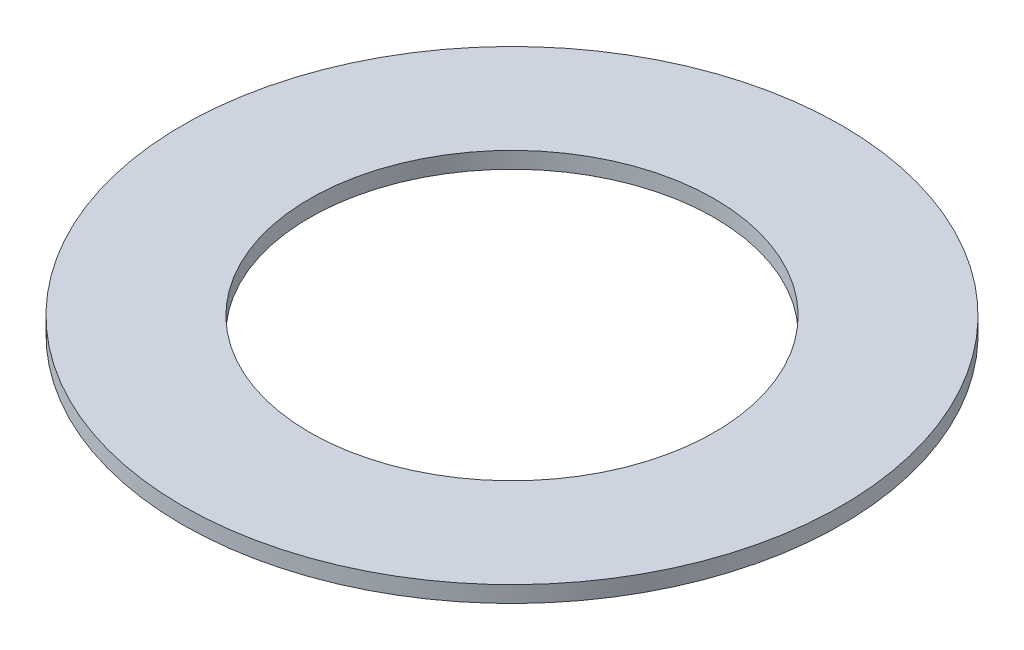
ISO-10303-21;
HEADER;
FILE_DESCRIPTION(('STEP AP214'),'2;1');
FILE_NAME('part.step','',(''),(''),'','','');
FILE_SCHEMA(('AUTOMOTIVE_DESIGN { 1 0 10303 214 1 1 1 1 }'));
ENDSEC;
DATA;
#1=APPLICATION_CONTEXT('core data for automotive mechanical design processes');
#2=APPLICATION_PROTOCOL_DEFINITION('international standard','automotive_design',2000,#1);
#3=PRODUCT_CONTEXT('',#1,'mechanical');
#4=PRODUCT('Part','Part','',(#3));
#5=PRODUCT_RELATED_PRODUCT_CATEGORY('part','',(#4));
#6=PRODUCT_DEFINITION_FORMATION('','',#4);
#7=PRODUCT_DEFINITION_CONTEXT('part definition',#1,'design');
#8=PRODUCT_DEFINITION('design','',#6,#7);
#9=PRODUCT_DEFINITION_SHAPE('','',#8);
#10=(LENGTH_UNIT() NAMED_UNIT(*) SI_UNIT(.MILLI.,.METRE.));
#11=(NAMED_UNIT(*) PLANE_ANGLE_UNIT() SI_UNIT($,.RADIAN.));
#12=(NAMED_UNIT(*) SI_UNIT($,.STERADIAN.) SOLID_ANGLE_UNIT());
#13=UNCERTAINTY_MEASURE_WITH_UNIT(LENGTH_MEASURE(1.E-05),#10,'distance_accuracy_value','');
#14=(GEOMETRIC_REPRESENTATION_CONTEXT(3) GLOBAL_UNCERTAINTY_ASSIGNED_CONTEXT((#13)) GLOBAL_UNIT_ASSIGNED_CONTEXT((#10,
#11,#12)) REPRESENTATION_CONTEXT('',''));
#15=CARTESIAN_POINT('',(0.,0.,0.));
#16=DIRECTION('',(0.,0.,1.));
#17=DIRECTION('',(1.,0.,0.));
#18=AXIS2_PLACEMENT_3D('',#15,#16,#17);
#19=CARTESIAN_POINT('',(0.,4.,0.));
#20=DIRECTION('',(0.,1.,0.));
#21=DIRECTION('',(0.,0.,1.));
#22=AXIS2_PLACEMENT_3D('',#19,#20,#21);
#23=PLANE('',#22);
#24=CARTESIAN_POINT('',(0.,4.,0.));
#25=DIRECTION('',(0.,1.,0.));
#26=DIRECTION('',(0.,0.,1.));
#27=AXIS2_PLACEMENT_3D('',#24,#25,#26);
#28=CIRCLE('',#27,80.7);
#29=CARTESIAN_POINT('',(0.,4.,80.7));
#30=VERTEX_POINT('',#29);
#31=EDGE_CURVE('E10',#30,#30,#28,.T.);
#32=ORIENTED_EDGE('',*,*,#31,.T.);
#33=EDGE_LOOP('',(#32));
#34=FACE_BOUND('',#33,.T.);
#35=CARTESIAN_POINT('',(0.,4.,0.));
#36=DIRECTION('',(0.,1.,0.));
#37=DIRECTION('',(0.,0.,1.));
#38=AXIS2_PLACEMENT_3D('',#35,#36,#37);
#39=CIRCLE('',#38,49.55);
#40=CARTESIAN_POINT('',(0.,4.,49.55));
#41=VERTEX_POINT('',#40);
#42=EDGE_CURVE('E52',#41,#41,#39,.T.);
#43=ORIENTED_EDGE('',*,*,#42,.F.);
#44=EDGE_LOOP('',(#43));
#45=FACE_BOUND('',#44,.T.);
#46=ADVANCED_FACE('F39',(#34,#45),#23,.T.);
#47=CARTESIAN_POINT('',(0.,0.,0.));
#48=DIRECTION('',(0.,1.,0.));
#49=DIRECTION('',(0.,0.,1.));
#50=AXIS2_PLACEMENT_3D('',#47,#48,#49);
#51=PLANE('',#50);
#52=CARTESIAN_POINT('',(0.,0.,0.));
#53=DIRECTION('',(0.,1.,0.));
#54=DIRECTION('',(0.,0.,1.));
#55=AXIS2_PLACEMENT_3D('',#52,#53,#54);
#56=CIRCLE('',#55,80.7);
#57=CARTESIAN_POINT('',(0.,0.,80.7));
#58=VERTEX_POINT('',#57);
#59=EDGE_CURVE('E43',#58,#58,#56,.T.);
#60=ORIENTED_EDGE('',*,*,#59,.F.);
#61=EDGE_LOOP('',(#60));
#62=FACE_BOUND('',#61,.T.);
#63=CARTESIAN_POINT('',(0.,0.,0.));
#64=DIRECTION('',(0.,1.,0.));
#65=DIRECTION('',(0.,0.,1.));
#66=AXIS2_PLACEMENT_3D('',#63,#64,#65);
#67=CIRCLE('',#66,49.55);
#68=CARTESIAN_POINT('',(0.,0.,49.55));
#69=VERTEX_POINT('',#68);
#70=EDGE_CURVE('E54',#69,#69,#67,.T.);
#71=ORIENTED_EDGE('',*,*,#70,.T.);
#72=EDGE_LOOP('',(#71));
#73=FACE_BOUND('',#72,.T.);
#74=ADVANCED_FACE('F66',(#62,#73),#51,.F.);
#75=CARTESIAN_POINT('',(0.,4.,0.));
#76=DIRECTION('',(0.,-1.,0.));
#77=DIRECTION('',(0.,0.,-1.));
#78=AXIS2_PLACEMENT_3D('',#75,#76,#77);
#79=CYLINDRICAL_SURFACE('',#78,80.7);
#80=ORIENTED_EDGE('',*,*,#31,.F.);
#81=EDGE_LOOP('',(#80));
#82=FACE_BOUND('',#81,.T.);
#83=ORIENTED_EDGE('',*,*,#59,.T.);
#84=EDGE_LOOP('',(#83));
#85=FACE_BOUND('',#84,.T.);
#86=ADVANCED_FACE('F41',(#82,#85),#79,.T.);
#87=CARTESIAN_POINT('',(0.,4.,0.));
#88=DIRECTION('',(0.,-1.,0.));
#89=DIRECTION('',(0.,0.,-1.));
#90=AXIS2_PLACEMENT_3D('',#87,#88,#89);
#91=CYLINDRICAL_SURFACE('',#90,49.55);
#92=ORIENTED_EDGE('',*,*,#42,.T.);
#93=EDGE_LOOP('',(#92));
#94=FACE_BOUND('',#93,.T.);
#95=ORIENTED_EDGE('',*,*,#70,.F.);
#96=EDGE_LOOP('',(#95));
#97=FACE_BOUND('',#96,.T.);
#98=ADVANCED_FACE('F62',(#94,#97),#91,.F.);
#99=CLOSED_SHELL('',(#46,#74,#86,#98));
#100=MANIFOLD_SOLID_BREP('B2',#99);
#101=ADVANCED_BREP_SHAPE_REPRESENTATION('',(#18,#100),#14);
#102=SHAPE_DEFINITION_REPRESENTATION(#9,#101);
ENDSEC;
END-ISO-10303-21;
